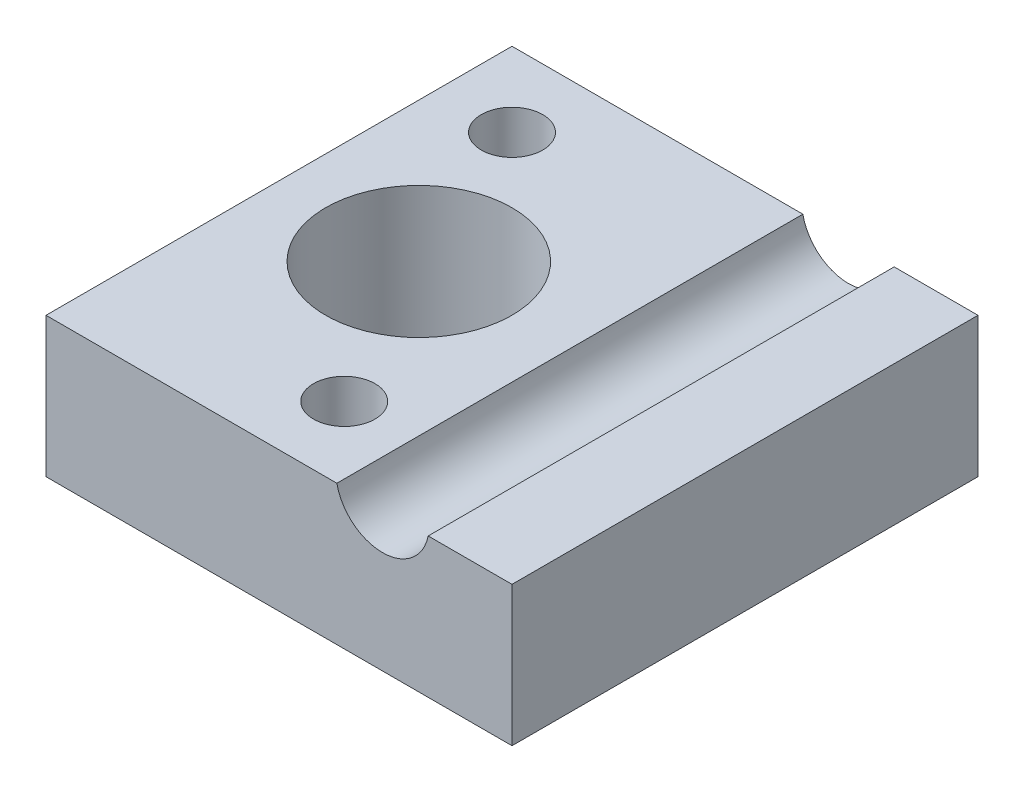
ISO-10303-21;
HEADER;
FILE_DESCRIPTION(('STEP AP214'),'2;1');
FILE_NAME('part.step','',(''),(''),'','','');
FILE_SCHEMA(('AUTOMOTIVE_DESIGN { 1 0 10303 214 1 1 1 1 }'));
ENDSEC;
DATA;
#1=APPLICATION_CONTEXT('core data for automotive mechanical design processes');
#2=APPLICATION_PROTOCOL_DEFINITION('international standard','automotive_design',2000,#1);
#3=PRODUCT_CONTEXT('',#1,'mechanical');
#4=PRODUCT('Part','Part','',(#3));
#5=PRODUCT_RELATED_PRODUCT_CATEGORY('part','',(#4));
#6=PRODUCT_DEFINITION_FORMATION('','',#4);
#7=PRODUCT_DEFINITION_CONTEXT('part definition',#1,'design');
#8=PRODUCT_DEFINITION('design','',#6,#7);
#9=PRODUCT_DEFINITION_SHAPE('','',#8);
#10=(LENGTH_UNIT() NAMED_UNIT(*) SI_UNIT(.MILLI.,.METRE.));
#11=(NAMED_UNIT(*) PLANE_ANGLE_UNIT() SI_UNIT($,.RADIAN.));
#12=(NAMED_UNIT(*) SI_UNIT($,.STERADIAN.) SOLID_ANGLE_UNIT());
#13=UNCERTAINTY_MEASURE_WITH_UNIT(LENGTH_MEASURE(1.E-05),#10,'distance_accuracy_value','');
#14=(GEOMETRIC_REPRESENTATION_CONTEXT(3) GLOBAL_UNCERTAINTY_ASSIGNED_CONTEXT((#13)) GLOBAL_UNIT_ASSIGNED_CONTEXT((#10,
#11,#12)) REPRESENTATION_CONTEXT('',''));
#15=CARTESIAN_POINT('',(0.,0.,0.));
#16=DIRECTION('',(0.,0.,1.));
#17=DIRECTION('',(1.,0.,0.));
#18=AXIS2_PLACEMENT_3D('',#15,#16,#17);
#19=CARTESIAN_POINT('',(-4.89897948556636,-1.,50.));
#20=DIRECTION('',(0.,-1.,0.));
#21=DIRECTION('',(1.,0.,0.));
#22=AXIS2_PLACEMENT_3D('',#19,#20,#21);
#23=PLANE('',#22);
#24=CARTESIAN_POINT('',(-21.1083377622209,-0.999999999999997,25.));
#25=DIRECTION('',(0.,-1.,0.));
#26=DIRECTION('',(0.,0.,-1.));
#27=AXIS2_PLACEMENT_3D('',#24,#25,#26);
#28=CIRCLE('',#27,10.);
#29=CARTESIAN_POINT('',(-21.1083377622209,-0.999999999999997,15.));
#30=VERTEX_POINT('',#29);
#31=EDGE_CURVE('E160',#30,#30,#28,.T.);
#32=ORIENTED_EDGE('',*,*,#31,.T.);
#33=EDGE_LOOP('',(#32));
#34=FACE_BOUND('',#33,.T.);
#35=CARTESIAN_POINT('',(-12.1083377622209,-1.,42.));
#36=DIRECTION('',(0.,-1.,0.));
#37=DIRECTION('',(0.,0.,-1.));
#38=AXIS2_PLACEMENT_3D('',#35,#36,#37);
#39=CIRCLE('',#38,3.3);
#40=CARTESIAN_POINT('',(-12.1083377622209,-1.,38.7));
#41=VERTEX_POINT('',#40);
#42=EDGE_CURVE('E164',#41,#41,#39,.T.);
#43=ORIENTED_EDGE('',*,*,#42,.T.);
#44=EDGE_LOOP('',(#43));
#45=FACE_BOUND('',#44,.T.);
#46=CARTESIAN_POINT('',(-28.1083377622209,-1.,8.));
#47=DIRECTION('',(0.,-1.,0.));
#48=DIRECTION('',(0.,0.,-1.));
#49=AXIS2_PLACEMENT_3D('',#46,#47,#48);
#50=CIRCLE('',#49,3.3);
#51=CARTESIAN_POINT('',(-28.1083377622209,-1.,4.7));
#52=VERTEX_POINT('',#51);
#53=EDGE_CURVE('E121',#52,#52,#50,.T.);
#54=ORIENTED_EDGE('',*,*,#53,.T.);
#55=EDGE_LOOP('',(#54));
#56=FACE_BOUND('',#55,.T.);
#57=DIRECTION('',(-1.,0.,0.));
#58=VECTOR('',#57,1.);
#59=CARTESIAN_POINT('',(-4.89897948556636,-1.,0.));
#60=LINE('',#59,#58);
#61=CARTESIAN_POINT('',(-4.89897948556635,-1.,0.));
#62=VERTEX_POINT('',#61);
#63=CARTESIAN_POINT('',(-36.1083377622209,-1.,0.));
#64=VERTEX_POINT('',#63);
#65=EDGE_CURVE('E117',#62,#64,#60,.T.);
#66=ORIENTED_EDGE('',*,*,#65,.T.);
#67=DIRECTION('',(0.,0.,-1.));
#68=VECTOR('',#67,1.);
#69=CARTESIAN_POINT('',(-36.1083377622209,-1.,50.));
#70=LINE('',#69,#68);
#71=CARTESIAN_POINT('',(-36.1083377622209,-1.,50.));
#72=VERTEX_POINT('',#71);
#73=EDGE_CURVE('E11',#72,#64,#70,.T.);
#74=ORIENTED_EDGE('',*,*,#73,.F.);
#75=DIRECTION('',(-1.,0.,0.));
#76=VECTOR('',#75,1.);
#77=CARTESIAN_POINT('',(-4.89897948556636,-1.,50.));
#78=LINE('',#77,#76);
#79=CARTESIAN_POINT('',(-4.89897948556635,-1.,50.));
#80=VERTEX_POINT('',#79);
#81=EDGE_CURVE('E128',#80,#72,#78,.T.);
#82=ORIENTED_EDGE('',*,*,#81,.F.);
#83=DIRECTION('',(0.,0.,-1.));
#84=VECTOR('',#83,1.);
#85=CARTESIAN_POINT('',(-4.89897948556635,-1.,50.));
#86=LINE('',#85,#84);
#87=EDGE_CURVE('E113',#80,#62,#86,.T.);
#88=ORIENTED_EDGE('',*,*,#87,.T.);
#89=EDGE_LOOP('',(#66,#74,#82,#88));
#90=FACE_BOUND('',#89,.T.);
#91=ADVANCED_FACE('F33',(#34,#45,#56,#90),#23,.F.);
#92=CARTESIAN_POINT('',(-36.1083377622209,-1.,50.));
#93=DIRECTION('',(1.,0.,0.));
#94=DIRECTION('',(0.,1.,0.));
#95=AXIS2_PLACEMENT_3D('',#92,#93,#94);
#96=PLANE('',#95);
#97=DIRECTION('',(0.,-1.,0.));
#98=VECTOR('',#97,1.);
#99=CARTESIAN_POINT('',(-36.1083377622209,-1.,0.));
#100=LINE('',#99,#98);
#101=CARTESIAN_POINT('',(-36.1083377622209,-16.,0.));
#102=VERTEX_POINT('',#101);
#103=EDGE_CURVE('E120',#64,#102,#100,.T.);
#104=ORIENTED_EDGE('',*,*,#103,.T.);
#105=DIRECTION('',(0.,0.,-1.));
#106=VECTOR('',#105,1.);
#107=CARTESIAN_POINT('',(-36.1083377622209,-16.,50.));
#108=LINE('',#107,#106);
#109=CARTESIAN_POINT('',(-36.1083377622209,-16.,50.));
#110=VERTEX_POINT('',#109);
#111=EDGE_CURVE('E41',#110,#102,#108,.T.);
#112=ORIENTED_EDGE('',*,*,#111,.F.);
#113=DIRECTION('',(0.,-1.,0.));
#114=VECTOR('',#113,1.);
#115=CARTESIAN_POINT('',(-36.1083377622209,-1.,50.));
#116=LINE('',#115,#114);
#117=EDGE_CURVE('E86',#72,#110,#116,.T.);
#118=ORIENTED_EDGE('',*,*,#117,.F.);
#119=ORIENTED_EDGE('',*,*,#73,.T.);
#120=EDGE_LOOP('',(#104,#112,#118,#119));
#121=FACE_BOUND('',#120,.T.);
#122=ADVANCED_FACE('F152',(#121),#96,.F.);
#123=CARTESIAN_POINT('',(-36.1083377622209,-16.,50.));
#124=DIRECTION('',(0.,1.,0.));
#125=DIRECTION('',(0.,0.,1.));
#126=AXIS2_PLACEMENT_3D('',#123,#124,#125);
#127=PLANE('',#126);
#128=CARTESIAN_POINT('',(-21.1083377622209,-16.,25.));
#129=DIRECTION('',(0.,-1.,0.));
#130=DIRECTION('',(0.,0.,-1.));
#131=AXIS2_PLACEMENT_3D('',#128,#129,#130);
#132=CIRCLE('',#131,10.);
#133=CARTESIAN_POINT('',(-21.1083377622209,-16.,15.));
#134=VERTEX_POINT('',#133);
#135=EDGE_CURVE('E191',#134,#134,#132,.T.);
#136=ORIENTED_EDGE('',*,*,#135,.F.);
#137=EDGE_LOOP('',(#136));
#138=FACE_BOUND('',#137,.T.);
#139=CARTESIAN_POINT('',(-12.1083377622209,-16.,42.));
#140=DIRECTION('',(0.,-1.,0.));
#141=DIRECTION('',(0.,0.,-1.));
#142=AXIS2_PLACEMENT_3D('',#139,#140,#141);
#143=CIRCLE('',#142,5.5);
#144=CARTESIAN_POINT('',(-12.1083377622209,-16.,36.5));
#145=VERTEX_POINT('',#144);
#146=EDGE_CURVE('E188',#145,#145,#143,.T.);
#147=ORIENTED_EDGE('',*,*,#146,.F.);
#148=EDGE_LOOP('',(#147));
#149=FACE_BOUND('',#148,.T.);
#150=CARTESIAN_POINT('',(-28.1083377622209,-16.,8.));
#151=DIRECTION('',(0.,-1.,0.));
#152=DIRECTION('',(0.,0.,-1.));
#153=AXIS2_PLACEMENT_3D('',#150,#151,#152);
#154=CIRCLE('',#153,5.5);
#155=CARTESIAN_POINT('',(-28.1083377622209,-16.,2.5));
#156=VERTEX_POINT('',#155);
#157=EDGE_CURVE('E178',#156,#156,#154,.T.);
#158=ORIENTED_EDGE('',*,*,#157,.F.);
#159=EDGE_LOOP('',(#158));
#160=FACE_BOUND('',#159,.T.);
#161=DIRECTION('',(1.,0.,0.));
#162=VECTOR('',#161,1.);
#163=CARTESIAN_POINT('',(-36.1083377622209,-16.,0.));
#164=LINE('',#163,#162);
#165=CARTESIAN_POINT('',(13.8916622377791,-16.,0.));
#166=VERTEX_POINT('',#165);
#167=EDGE_CURVE('E123',#102,#166,#164,.T.);
#168=ORIENTED_EDGE('',*,*,#167,.T.);
#169=DIRECTION('',(0.,0.,-1.));
#170=VECTOR('',#169,1.);
#171=CARTESIAN_POINT('',(13.8916622377791,-16.,50.));
#172=LINE('',#171,#170);
#173=CARTESIAN_POINT('',(13.8916622377791,-16.,50.));
#174=VERTEX_POINT('',#173);
#175=EDGE_CURVE('E108',#174,#166,#172,.T.);
#176=ORIENTED_EDGE('',*,*,#175,.F.);
#177=DIRECTION('',(1.,0.,0.));
#178=VECTOR('',#177,1.);
#179=CARTESIAN_POINT('',(-36.1083377622209,-16.,50.));
#180=LINE('',#179,#178);
#181=EDGE_CURVE('E99',#110,#174,#180,.T.);
#182=ORIENTED_EDGE('',*,*,#181,.F.);
#183=ORIENTED_EDGE('',*,*,#111,.T.);
#184=EDGE_LOOP('',(#168,#176,#182,#183));
#185=FACE_BOUND('',#184,.T.);
#186=ADVANCED_FACE('F134',(#138,#149,#160,#185),#127,.F.);
#187=CARTESIAN_POINT('',(13.8916622377791,-16.,50.));
#188=DIRECTION('',(-1.,0.,0.));
#189=DIRECTION('',(0.,0.,1.));
#190=AXIS2_PLACEMENT_3D('',#187,#188,#189);
#191=PLANE('',#190);
#192=DIRECTION('',(0.,1.,0.));
#193=VECTOR('',#192,1.);
#194=CARTESIAN_POINT('',(13.8916622377791,-16.,0.));
#195=LINE('',#194,#193);
#196=CARTESIAN_POINT('',(13.8916622377791,-0.999999999999997,0.));
#197=VERTEX_POINT('',#196);
#198=EDGE_CURVE('E107',#166,#197,#195,.T.);
#199=ORIENTED_EDGE('',*,*,#198,.T.);
#200=DIRECTION('',(0.,0.,-1.));
#201=VECTOR('',#200,1.);
#202=CARTESIAN_POINT('',(13.8916622377791,-0.999999999999997,50.));
#203=LINE('',#202,#201);
#204=CARTESIAN_POINT('',(13.8916622377791,-0.999999999999997,50.));
#205=VERTEX_POINT('',#204);
#206=EDGE_CURVE('E104',#205,#197,#203,.T.);
#207=ORIENTED_EDGE('',*,*,#206,.F.);
#208=DIRECTION('',(0.,1.,0.));
#209=VECTOR('',#208,1.);
#210=CARTESIAN_POINT('',(13.8916622377791,-16.,50.));
#211=LINE('',#210,#209);
#212=EDGE_CURVE('E93',#174,#205,#211,.T.);
#213=ORIENTED_EDGE('',*,*,#212,.F.);
#214=ORIENTED_EDGE('',*,*,#175,.T.);
#215=EDGE_LOOP('',(#199,#207,#213,#214));
#216=FACE_BOUND('',#215,.T.);
#217=ADVANCED_FACE('F105',(#216),#191,.F.);
#218=CARTESIAN_POINT('',(13.8916622377791,-0.999999999999997,50.));
#219=DIRECTION('',(0.,-1.,0.));
#220=DIRECTION('',(1.,0.,0.));
#221=AXIS2_PLACEMENT_3D('',#218,#219,#220);
#222=PLANE('',#221);
#223=DIRECTION('',(-1.,0.,0.));
#224=VECTOR('',#223,1.);
#225=CARTESIAN_POINT('',(13.8916622377791,-0.999999999999997,0.));
#226=LINE('',#225,#224);
#227=CARTESIAN_POINT('',(4.89897948556636,-1.,0.));
#228=VERTEX_POINT('',#227);
#229=EDGE_CURVE('E72',#197,#228,#226,.T.);
#230=ORIENTED_EDGE('',*,*,#229,.T.);
#231=DIRECTION('',(0.,0.,-1.));
#232=VECTOR('',#231,1.);
#233=CARTESIAN_POINT('',(4.89897948556636,-1.,50.));
#234=LINE('',#233,#232);
#235=CARTESIAN_POINT('',(4.89897948556636,-1.,50.));
#236=VERTEX_POINT('',#235);
#237=EDGE_CURVE('E109',#236,#228,#234,.T.);
#238=ORIENTED_EDGE('',*,*,#237,.F.);
#239=DIRECTION('',(-1.,0.,0.));
#240=VECTOR('',#239,1.);
#241=CARTESIAN_POINT('',(13.8916622377791,-0.999999999999997,50.));
#242=LINE('',#241,#240);
#243=EDGE_CURVE('E97',#205,#236,#242,.T.);
#244=ORIENTED_EDGE('',*,*,#243,.F.);
#245=ORIENTED_EDGE('',*,*,#206,.T.);
#246=EDGE_LOOP('',(#230,#238,#244,#245));
#247=FACE_BOUND('',#246,.T.);
#248=ADVANCED_FACE('F111',(#247),#222,.F.);
#249=CARTESIAN_POINT('',(0.,0.,50.));
#250=DIRECTION('',(0.,0.,-1.));
#251=DIRECTION('',(-1.,0.,0.));
#252=AXIS2_PLACEMENT_3D('',#249,#250,#251);
#253=CYLINDRICAL_SURFACE('',#252,5.);
#254=CARTESIAN_POINT('',(0.,0.,0.));
#255=DIRECTION('',(0.,0.,-1.));
#256=DIRECTION('',(-1.,0.,0.));
#257=AXIS2_PLACEMENT_3D('',#254,#255,#256);
#258=CIRCLE('',#257,5.);
#259=EDGE_CURVE('E78',#228,#62,#258,.T.);
#260=ORIENTED_EDGE('',*,*,#259,.T.);
#261=ORIENTED_EDGE('',*,*,#87,.F.);
#262=CARTESIAN_POINT('',(0.,0.,50.));
#263=DIRECTION('',(0.,0.,-1.));
#264=DIRECTION('',(-1.,0.,0.));
#265=AXIS2_PLACEMENT_3D('',#262,#263,#264);
#266=CIRCLE('',#265,5.);
#267=EDGE_CURVE('E49',#236,#80,#266,.T.);
#268=ORIENTED_EDGE('',*,*,#267,.F.);
#269=ORIENTED_EDGE('',*,*,#237,.T.);
#270=EDGE_LOOP('',(#260,#261,#268,#269));
#271=FACE_BOUND('',#270,.T.);
#272=ADVANCED_FACE('F141',(#271),#253,.F.);
#273=CARTESIAN_POINT('',(0.,0.,50.));
#274=DIRECTION('',(0.,0.,-1.));
#275=DIRECTION('',(-1.,0.,0.));
#276=AXIS2_PLACEMENT_3D('',#273,#274,#275);
#277=PLANE('',#276);
#278=ORIENTED_EDGE('',*,*,#81,.T.);
#279=ORIENTED_EDGE('',*,*,#117,.T.);
#280=ORIENTED_EDGE('',*,*,#181,.T.);
#281=ORIENTED_EDGE('',*,*,#212,.T.);
#282=ORIENTED_EDGE('',*,*,#243,.T.);
#283=ORIENTED_EDGE('',*,*,#267,.T.);
#284=EDGE_LOOP('',(#278,#279,#280,#281,#282,#283));
#285=FACE_BOUND('',#284,.T.);
#286=ADVANCED_FACE('F95',(#285),#277,.F.);
#287=CARTESIAN_POINT('',(0.,0.,0.));
#288=DIRECTION('',(0.,0.,-1.));
#289=DIRECTION('',(-1.,0.,0.));
#290=AXIS2_PLACEMENT_3D('',#287,#288,#289);
#291=PLANE('',#290);
#292=ORIENTED_EDGE('',*,*,#65,.F.);
#293=ORIENTED_EDGE('',*,*,#259,.F.);
#294=ORIENTED_EDGE('',*,*,#229,.F.);
#295=ORIENTED_EDGE('',*,*,#198,.F.);
#296=ORIENTED_EDGE('',*,*,#167,.F.);
#297=ORIENTED_EDGE('',*,*,#103,.F.);
#298=EDGE_LOOP('',(#292,#293,#294,#295,#296,#297));
#299=FACE_BOUND('',#298,.T.);
#300=ADVANCED_FACE('F137',(#299),#291,.T.);
#301=CARTESIAN_POINT('',(-28.1083377622209,-16.,8.));
#302=DIRECTION('',(0.,-1.,0.));
#303=DIRECTION('',(0.,0.,-1.));
#304=AXIS2_PLACEMENT_3D('',#301,#302,#303);
#305=CYLINDRICAL_SURFACE('',#304,3.3);
#306=ORIENTED_EDGE('',*,*,#53,.F.);
#307=EDGE_LOOP('',(#306));
#308=FACE_BOUND('',#307,.T.);
#309=CARTESIAN_POINT('',(-28.1083377622209,-9.6,8.));
#310=DIRECTION('',(0.,-1.,0.));
#311=DIRECTION('',(0.,0.,-1.));
#312=AXIS2_PLACEMENT_3D('',#309,#310,#311);
#313=CIRCLE('',#312,3.3);
#314=CARTESIAN_POINT('',(-28.1083377622209,-9.6,4.7));
#315=VERTEX_POINT('',#314);
#316=EDGE_CURVE('E168',#315,#315,#313,.T.);
#317=ORIENTED_EDGE('',*,*,#316,.T.);
#318=EDGE_LOOP('',(#317));
#319=FACE_BOUND('',#318,.T.);
#320=ADVANCED_FACE('F218',(#308,#319),#305,.F.);
#321=CARTESIAN_POINT('',(-24.8083377622209,-9.6,8.));
#322=DIRECTION('',(0.,1.,0.));
#323=DIRECTION('',(0.,0.,1.));
#324=AXIS2_PLACEMENT_3D('',#321,#322,#323);
#325=PLANE('',#324);
#326=ORIENTED_EDGE('',*,*,#316,.F.);
#327=EDGE_LOOP('',(#326));
#328=FACE_BOUND('',#327,.T.);
#329=CARTESIAN_POINT('',(-28.1083377622209,-9.6,8.));
#330=DIRECTION('',(0.,-1.,0.));
#331=DIRECTION('',(0.,0.,-1.));
#332=AXIS2_PLACEMENT_3D('',#329,#330,#331);
#333=CIRCLE('',#332,5.5);
#334=CARTESIAN_POINT('',(-28.1083377622209,-9.6,2.5));
#335=VERTEX_POINT('',#334);
#336=EDGE_CURVE('E171',#335,#335,#333,.T.);
#337=ORIENTED_EDGE('',*,*,#336,.T.);
#338=EDGE_LOOP('',(#337));
#339=FACE_BOUND('',#338,.T.);
#340=ADVANCED_FACE('F208',(#328,#339),#325,.F.);
#341=CARTESIAN_POINT('',(-28.1083377622209,-16.,8.));
#342=DIRECTION('',(0.,-1.,0.));
#343=DIRECTION('',(0.,0.,-1.));
#344=AXIS2_PLACEMENT_3D('',#341,#342,#343);
#345=CYLINDRICAL_SURFACE('',#344,5.5);
#346=ORIENTED_EDGE('',*,*,#336,.F.);
#347=EDGE_LOOP('',(#346));
#348=FACE_BOUND('',#347,.T.);
#349=ORIENTED_EDGE('',*,*,#157,.T.);
#350=EDGE_LOOP('',(#349));
#351=FACE_BOUND('',#350,.T.);
#352=ADVANCED_FACE('F205',(#348,#351),#345,.F.);
#353=CARTESIAN_POINT('',(-12.1083377622209,-16.,42.));
#354=DIRECTION('',(0.,-1.,0.));
#355=DIRECTION('',(0.,0.,-1.));
#356=AXIS2_PLACEMENT_3D('',#353,#354,#355);
#357=CYLINDRICAL_SURFACE('',#356,3.3);
#358=ORIENTED_EDGE('',*,*,#42,.F.);
#359=EDGE_LOOP('',(#358));
#360=FACE_BOUND('',#359,.T.);
#361=CARTESIAN_POINT('',(-12.1083377622209,-9.6,42.));
#362=DIRECTION('',(0.,-1.,0.));
#363=DIRECTION('',(0.,0.,-1.));
#364=AXIS2_PLACEMENT_3D('',#361,#362,#363);
#365=CIRCLE('',#364,3.3);
#366=CARTESIAN_POINT('',(-12.1083377622209,-9.6,38.7));
#367=VERTEX_POINT('',#366);
#368=EDGE_CURVE('E182',#367,#367,#365,.T.);
#369=ORIENTED_EDGE('',*,*,#368,.T.);
#370=EDGE_LOOP('',(#369));
#371=FACE_BOUND('',#370,.T.);
#372=ADVANCED_FACE('F207',(#360,#371),#357,.F.);
#373=CARTESIAN_POINT('',(-8.80833776222093,-9.6,42.));
#374=DIRECTION('',(0.,1.,0.));
#375=DIRECTION('',(0.,0.,1.));
#376=AXIS2_PLACEMENT_3D('',#373,#374,#375);
#377=PLANE('',#376);
#378=ORIENTED_EDGE('',*,*,#368,.F.);
#379=EDGE_LOOP('',(#378));
#380=FACE_BOUND('',#379,.T.);
#381=CARTESIAN_POINT('',(-12.1083377622209,-9.6,42.));
#382=DIRECTION('',(0.,-1.,0.));
#383=DIRECTION('',(0.,0.,-1.));
#384=AXIS2_PLACEMENT_3D('',#381,#382,#383);
#385=CIRCLE('',#384,5.5);
#386=CARTESIAN_POINT('',(-12.1083377622209,-9.6,36.5));
#387=VERTEX_POINT('',#386);
#388=EDGE_CURVE('E185',#387,#387,#385,.T.);
#389=ORIENTED_EDGE('',*,*,#388,.T.);
#390=EDGE_LOOP('',(#389));
#391=FACE_BOUND('',#390,.T.);
#392=ADVANCED_FACE('F215',(#380,#391),#377,.F.);
#393=CARTESIAN_POINT('',(-12.1083377622209,-16.,42.));
#394=DIRECTION('',(0.,-1.,0.));
#395=DIRECTION('',(0.,0.,-1.));
#396=AXIS2_PLACEMENT_3D('',#393,#394,#395);
#397=CYLINDRICAL_SURFACE('',#396,5.5);
#398=ORIENTED_EDGE('',*,*,#388,.F.);
#399=EDGE_LOOP('',(#398));
#400=FACE_BOUND('',#399,.T.);
#401=ORIENTED_EDGE('',*,*,#146,.T.);
#402=EDGE_LOOP('',(#401));
#403=FACE_BOUND('',#402,.T.);
#404=ADVANCED_FACE('F257',(#400,#403),#397,.F.);
#405=CARTESIAN_POINT('',(-21.1083377622209,-0.999999999999997,25.));
#406=DIRECTION('',(0.,-1.,0.));
#407=DIRECTION('',(0.,0.,-1.));
#408=AXIS2_PLACEMENT_3D('',#405,#406,#407);
#409=CYLINDRICAL_SURFACE('',#408,10.);
#410=ORIENTED_EDGE('',*,*,#31,.F.);
#411=EDGE_LOOP('',(#410));
#412=FACE_BOUND('',#411,.T.);
#413=ORIENTED_EDGE('',*,*,#135,.T.);
#414=EDGE_LOOP('',(#413));
#415=FACE_BOUND('',#414,.T.);
#416=ADVANCED_FACE('F196',(#412,#415),#409,.F.);
#417=CLOSED_SHELL('',(#91,#122,#186,#217,#248,#272,#286,#300,#320,#340,#352,#372,#392,#404,#416));
#418=MANIFOLD_SOLID_BREP('B2',#417);
#419=ADVANCED_BREP_SHAPE_REPRESENTATION('',(#18,#418),#14);
#420=SHAPE_DEFINITION_REPRESENTATION(#9,#419);
ENDSEC;
END-ISO-10303-21;
